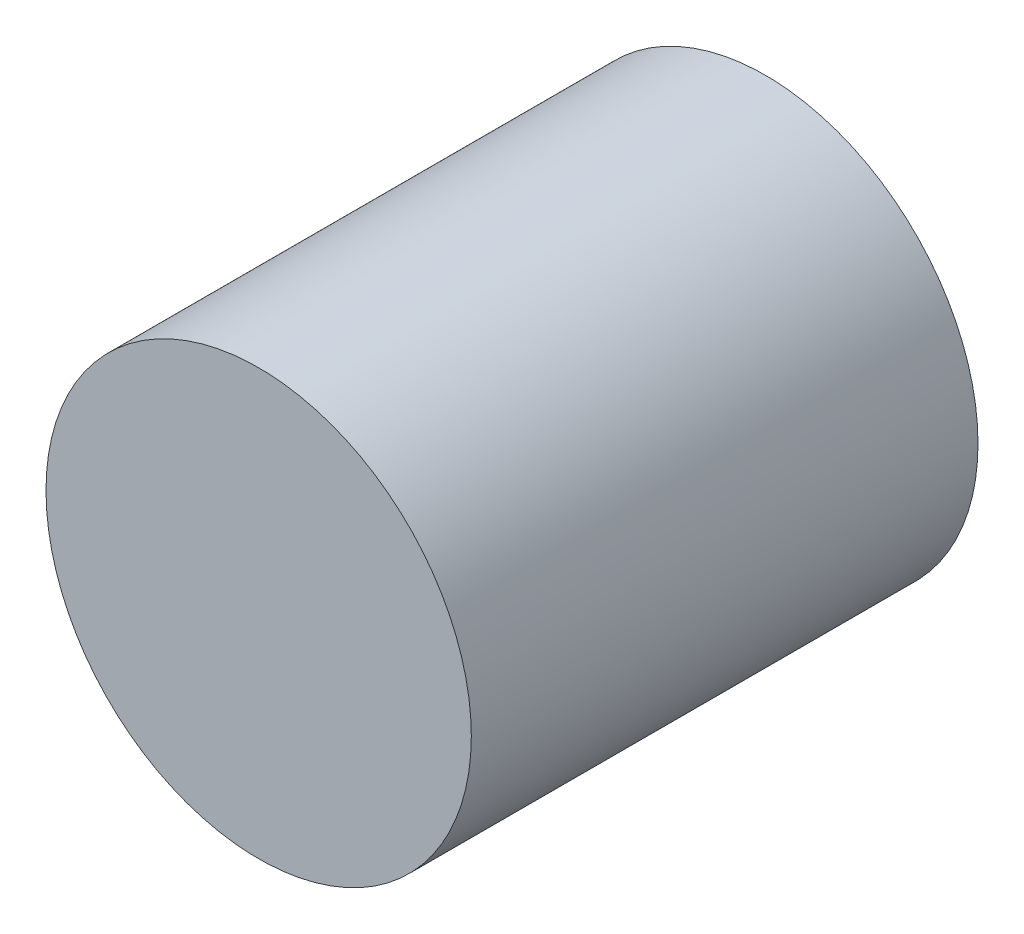
ISO-10303-21;
HEADER;
FILE_DESCRIPTION(('STEP AP214'),'2;1');
FILE_NAME('part.step','',(''),(''),'','','');
FILE_SCHEMA(('AUTOMOTIVE_DESIGN { 1 0 10303 214 1 1 1 1 }'));
ENDSEC;
DATA;
#1=APPLICATION_CONTEXT('core data for automotive mechanical design processes');
#2=APPLICATION_PROTOCOL_DEFINITION('international standard','automotive_design',2000,#1);
#3=PRODUCT_CONTEXT('',#1,'mechanical');
#4=PRODUCT('Part','Part','',(#3));
#5=PRODUCT_RELATED_PRODUCT_CATEGORY('part','',(#4));
#6=PRODUCT_DEFINITION_FORMATION('','',#4);
#7=PRODUCT_DEFINITION_CONTEXT('part definition',#1,'design');
#8=PRODUCT_DEFINITION('design','',#6,#7);
#9=PRODUCT_DEFINITION_SHAPE('','',#8);
#10=(LENGTH_UNIT() NAMED_UNIT(*) SI_UNIT(.MILLI.,.METRE.));
#11=(NAMED_UNIT(*) PLANE_ANGLE_UNIT() SI_UNIT($,.RADIAN.));
#12=(NAMED_UNIT(*) SI_UNIT($,.STERADIAN.) SOLID_ANGLE_UNIT());
#13=UNCERTAINTY_MEASURE_WITH_UNIT(LENGTH_MEASURE(1.E-05),#10,'distance_accuracy_value','');
#14=(GEOMETRIC_REPRESENTATION_CONTEXT(3) GLOBAL_UNCERTAINTY_ASSIGNED_CONTEXT((#13)) GLOBAL_UNIT_ASSIGNED_CONTEXT((#10,
#11,#12)) REPRESENTATION_CONTEXT('',''));
#15=CARTESIAN_POINT('',(0.,0.,0.));
#16=DIRECTION('',(0.,0.,1.));
#17=DIRECTION('',(1.,0.,0.));
#18=AXIS2_PLACEMENT_3D('',#15,#16,#17);
#19=CARTESIAN_POINT('',(0.,0.,33.));
#20=DIRECTION('',(0.,0.,-1.));
#21=DIRECTION('',(-1.,0.,0.));
#22=AXIS2_PLACEMENT_3D('',#19,#20,#21);
#23=CYLINDRICAL_SURFACE('',#22,13.85);
#24=CARTESIAN_POINT('',(0.,0.,33.));
#25=DIRECTION('',(0.,0.,1.));
#26=DIRECTION('',(1.,0.,0.));
#27=AXIS2_PLACEMENT_3D('',#24,#25,#26);
#28=CIRCLE('',#27,13.85);
#29=CARTESIAN_POINT('',(13.85,0.,33.));
#30=VERTEX_POINT('',#29);
#31=EDGE_CURVE('E10',#30,#30,#28,.T.);
#32=ORIENTED_EDGE('',*,*,#31,.F.);
#33=EDGE_LOOP('',(#32));
#34=FACE_BOUND('',#33,.T.);
#35=CARTESIAN_POINT('',(0.,0.,0.));
#36=DIRECTION('',(0.,0.,1.));
#37=DIRECTION('',(1.,0.,0.));
#38=AXIS2_PLACEMENT_3D('',#35,#36,#37);
#39=CIRCLE('',#38,13.85);
#40=CARTESIAN_POINT('',(13.85,0.,0.));
#41=VERTEX_POINT('',#40);
#42=EDGE_CURVE('E44',#41,#41,#39,.T.);
#43=ORIENTED_EDGE('',*,*,#42,.T.);
#44=EDGE_LOOP('',(#43));
#45=FACE_BOUND('',#44,.T.);
#46=ADVANCED_FACE('F41',(#34,#45),#23,.T.);
#47=CARTESIAN_POINT('',(0.,0.,33.));
#48=DIRECTION('',(0.,0.,1.));
#49=DIRECTION('',(1.,0.,0.));
#50=AXIS2_PLACEMENT_3D('',#47,#48,#49);
#51=PLANE('',#50);
#52=ORIENTED_EDGE('',*,*,#31,.T.);
#53=EDGE_LOOP('',(#52));
#54=FACE_BOUND('',#53,.T.);
#55=ADVANCED_FACE('F56',(#54),#51,.T.);
#56=CARTESIAN_POINT('',(0.,0.,0.));
#57=DIRECTION('',(0.,0.,1.));
#58=DIRECTION('',(1.,0.,0.));
#59=AXIS2_PLACEMENT_3D('',#56,#57,#58);
#60=PLANE('',#59);
#61=ORIENTED_EDGE('',*,*,#42,.F.);
#62=EDGE_LOOP('',(#61));
#63=FACE_BOUND('',#62,.T.);
#64=ADVANCED_FACE('F54',(#63),#60,.F.);
#65=CLOSED_SHELL('',(#46,#55,#64));
#66=MANIFOLD_SOLID_BREP('B2',#65);
#67=ADVANCED_BREP_SHAPE_REPRESENTATION('',(#18,#66),#14);
#68=SHAPE_DEFINITION_REPRESENTATION(#9,#67);
ENDSEC;
END-ISO-10303-21;
